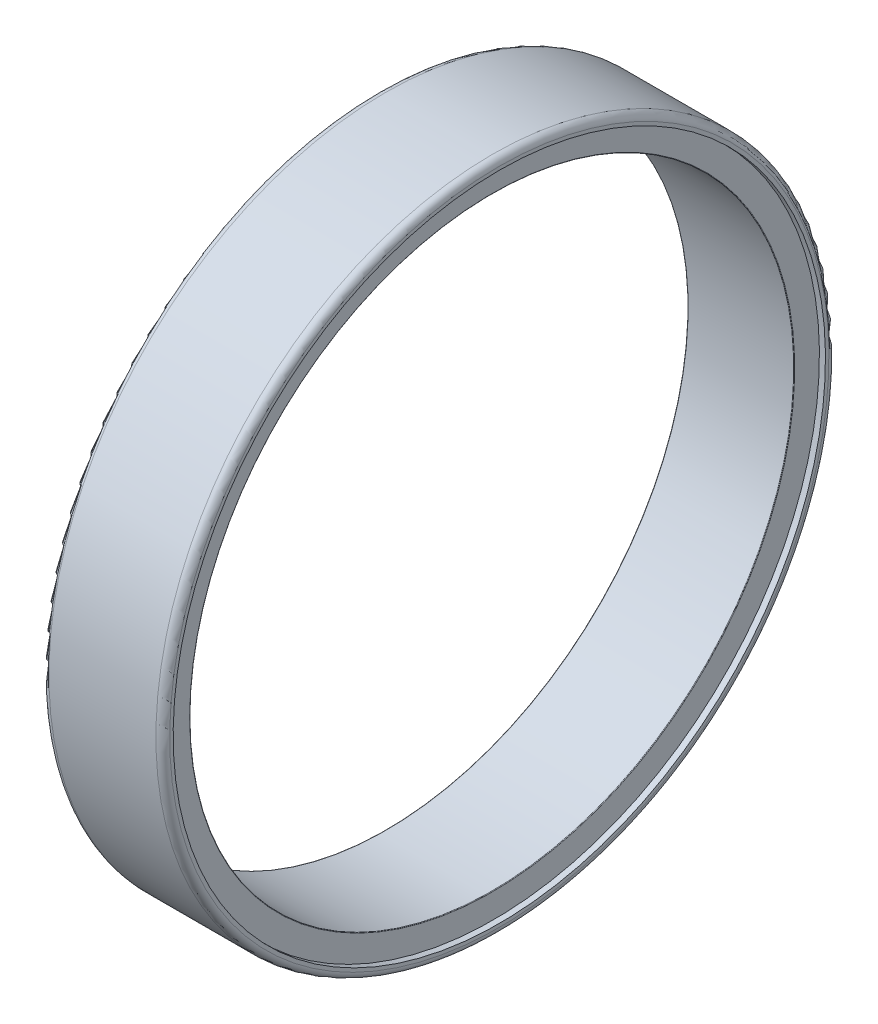
ISO-10303-21;
HEADER;
FILE_DESCRIPTION(('STEP AP214'),'2;1');
FILE_NAME('part.step','',(''),(''),'','','');
FILE_SCHEMA(('AUTOMOTIVE_DESIGN { 1 0 10303 214 1 1 1 1 }'));
ENDSEC;
DATA;
#1=APPLICATION_CONTEXT('core data for automotive mechanical design processes');
#2=APPLICATION_PROTOCOL_DEFINITION('international standard','automotive_design',2000,#1);
#3=PRODUCT_CONTEXT('',#1,'mechanical');
#4=PRODUCT('Part','Part','',(#3));
#5=PRODUCT_RELATED_PRODUCT_CATEGORY('part','',(#4));
#6=PRODUCT_DEFINITION_FORMATION('','',#4);
#7=PRODUCT_DEFINITION_CONTEXT('part definition',#1,'design');
#8=PRODUCT_DEFINITION('design','',#6,#7);
#9=PRODUCT_DEFINITION_SHAPE('','',#8);
#10=(LENGTH_UNIT() NAMED_UNIT(*) SI_UNIT(.MILLI.,.METRE.));
#11=(NAMED_UNIT(*) PLANE_ANGLE_UNIT() SI_UNIT($,.RADIAN.));
#12=(NAMED_UNIT(*) SI_UNIT($,.STERADIAN.) SOLID_ANGLE_UNIT());
#13=UNCERTAINTY_MEASURE_WITH_UNIT(LENGTH_MEASURE(1.E-05),#10,'distance_accuracy_value','');
#14=(GEOMETRIC_REPRESENTATION_CONTEXT(3) GLOBAL_UNCERTAINTY_ASSIGNED_CONTEXT((#13)) GLOBAL_UNIT_ASSIGNED_CONTEXT((#10,
#11,#12)) REPRESENTATION_CONTEXT('',''));
#15=CARTESIAN_POINT('',(0.,0.,0.));
#16=DIRECTION('',(0.,0.,1.));
#17=DIRECTION('',(1.,0.,0.));
#18=AXIS2_PLACEMENT_3D('',#15,#16,#17);
#19=CARTESIAN_POINT('',(-31.75,-1.35165943746456E-13,0.));
#20=DIRECTION('',(1.,0.,0.));
#21=DIRECTION('',(0.,1.,0.));
#22=AXIS2_PLACEMENT_3D('',#19,#20,#21);
#23=CYLINDRICAL_SURFACE('',#22,38.1999999999999);
#24=CARTESIAN_POINT('',(6.30000000000008,0.,0.));
#25=DIRECTION('',(1.,0.,0.));
#26=DIRECTION('',(0.,1.,0.));
#27=AXIS2_PLACEMENT_3D('',#24,#25,#26);
#28=CIRCLE('',#27,38.1999999999999);
#29=CARTESIAN_POINT('',(6.29999999999999,38.1999999999999,0.));
#30=VERTEX_POINT('',#29);
#31=EDGE_CURVE('E70',#30,#30,#28,.T.);
#32=ORIENTED_EDGE('',*,*,#31,.T.);
#33=EDGE_LOOP('',(#32));
#34=FACE_BOUND('',#33,.T.);
#35=CARTESIAN_POINT('',(6.12125120224324,0.,0.));
#36=DIRECTION('',(-1.,0.,0.));
#37=DIRECTION('',(0.,0.,1.));
#38=AXIS2_PLACEMENT_3D('',#35,#36,#37);
#39=CIRCLE('',#38,38.1999999999999);
#40=CARTESIAN_POINT('',(6.12125120224324,0.,38.1999999999999));
#41=VERTEX_POINT('',#40);
#42=EDGE_CURVE('E39',#41,#41,#39,.T.);
#43=ORIENTED_EDGE('',*,*,#42,.T.);
#44=EDGE_LOOP('',(#43));
#45=FACE_BOUND('',#44,.T.);
#46=ADVANCED_FACE('F35',(#34,#45),#23,.F.);
#47=CARTESIAN_POINT('',(-6.29999999999992,0.,0.));
#48=DIRECTION('',(1.,0.,0.));
#49=DIRECTION('',(0.,1.,0.));
#50=AXIS2_PLACEMENT_3D('',#47,#48,#49);
#51=CIRCLE('',#50,38.1999999999999);
#52=CARTESIAN_POINT('',(-6.30000000000001,38.1999999999999,0.));
#53=VERTEX_POINT('',#52);
#54=EDGE_CURVE('E57',#53,#53,#51,.T.);
#55=ORIENTED_EDGE('',*,*,#54,.F.);
#56=EDGE_LOOP('',(#55));
#57=FACE_BOUND('',#56,.T.);
#58=CARTESIAN_POINT('',(-6.12125120224324,0.,0.));
#59=DIRECTION('',(1.,0.,0.));
#60=DIRECTION('',(0.,0.,-1.));
#61=AXIS2_PLACEMENT_3D('',#58,#59,#60);
#62=CIRCLE('',#61,38.1999999999999);
#63=CARTESIAN_POINT('',(-6.12125120224324,0.,-38.1999999999999));
#64=VERTEX_POINT('',#63);
#65=EDGE_CURVE('E51',#64,#64,#62,.T.);
#66=ORIENTED_EDGE('',*,*,#65,.T.);
#67=EDGE_LOOP('',(#66));
#68=FACE_BOUND('',#67,.T.);
#69=ADVANCED_FACE('F105',(#57,#68),#23,.F.);
#70=CARTESIAN_POINT('',(-6.30000000000001,38.1999999999999,0.));
#71=DIRECTION('',(1.,0.,0.));
#72=DIRECTION('',(0.,1.,0.));
#73=AXIS2_PLACEMENT_3D('',#70,#71,#72);
#74=PLANE('',#73);
#75=ORIENTED_EDGE('',*,*,#54,.T.);
#76=EDGE_LOOP('',(#75));
#77=FACE_BOUND('',#76,.T.);
#78=CARTESIAN_POINT('',(-6.29999999999992,0.,0.));
#79=DIRECTION('',(1.,0.,0.));
#80=DIRECTION('',(0.,1.,0.));
#81=AXIS2_PLACEMENT_3D('',#78,#79,#80);
#82=CIRCLE('',#81,37.8);
#83=CARTESIAN_POINT('',(-6.30000000000001,37.7999999999999,0.));
#84=VERTEX_POINT('',#83);
#85=EDGE_CURVE('E10',#84,#84,#82,.T.);
#86=ORIENTED_EDGE('',*,*,#85,.F.);
#87=EDGE_LOOP('',(#86));
#88=FACE_BOUND('',#87,.T.);
#89=ADVANCED_FACE('F37',(#77,#88),#74,.T.);
#90=CARTESIAN_POINT('',(-31.75,-1.35165943746456E-13,0.));
#91=DIRECTION('',(1.,0.,0.));
#92=DIRECTION('',(0.,1.,0.));
#93=AXIS2_PLACEMENT_3D('',#90,#91,#92);
#94=CYLINDRICAL_SURFACE('',#93,37.8);
#95=ORIENTED_EDGE('',*,*,#85,.T.);
#96=EDGE_LOOP('',(#95));
#97=FACE_BOUND('',#96,.T.);
#98=CARTESIAN_POINT('',(-6.99999999999992,0.,0.));
#99=DIRECTION('',(1.,0.,0.));
#100=DIRECTION('',(0.,1.,0.));
#101=AXIS2_PLACEMENT_3D('',#98,#99,#100);
#102=CIRCLE('',#101,37.8);
#103=CARTESIAN_POINT('',(-7.00000000000001,37.7999999999999,0.));
#104=VERTEX_POINT('',#103);
#105=EDGE_CURVE('E43',#104,#104,#102,.T.);
#106=ORIENTED_EDGE('',*,*,#105,.F.);
#107=EDGE_LOOP('',(#106));
#108=FACE_BOUND('',#107,.T.);
#109=ADVANCED_FACE('F95',(#97,#108),#94,.F.);
#110=CARTESIAN_POINT('',(-7.00000000000001,37.7999999999999,0.));
#111=DIRECTION('',(-1.,0.,0.));
#112=DIRECTION('',(0.,-1.,0.));
#113=AXIS2_PLACEMENT_3D('',#110,#111,#112);
#114=PLANE('',#113);
#115=ORIENTED_EDGE('',*,*,#105,.T.);
#116=EDGE_LOOP('',(#115));
#117=FACE_BOUND('',#116,.T.);
#118=CARTESIAN_POINT('',(-6.99999999999992,0.,0.));
#119=DIRECTION('',(1.,0.,0.));
#120=DIRECTION('',(0.,1.,0.));
#121=AXIS2_PLACEMENT_3D('',#118,#119,#120);
#122=CIRCLE('',#121,38.1999999999999);
#123=CARTESIAN_POINT('',(-7.00000000000001,38.1999999999999,0.));
#124=VERTEX_POINT('',#123);
#125=EDGE_CURVE('E48',#124,#124,#122,.T.);
#126=ORIENTED_EDGE('',*,*,#125,.F.);
#127=EDGE_LOOP('',(#126));
#128=FACE_BOUND('',#127,.T.);
#129=ADVANCED_FACE('F93',(#117,#128),#114,.T.);
#130=CARTESIAN_POINT('',(-6.19999999999992,0.,0.));
#131=DIRECTION('',(1.,0.,0.));
#132=DIRECTION('',(0.,1.,0.));
#133=AXIS2_PLACEMENT_3D('',#130,#131,#132);
#134=TOROIDAL_SURFACE('',#133,38.1999999999999,0.800000000000001);
#135=ORIENTED_EDGE('',*,*,#125,.T.);
#136=EDGE_LOOP('',(#135));
#137=FACE_BOUND('',#136,.T.);
#138=CARTESIAN_POINT('',(-6.19999999999991,0.,0.));
#139=DIRECTION('',(1.,0.,0.));
#140=DIRECTION('',(0.,1.,0.));
#141=AXIS2_PLACEMENT_3D('',#138,#139,#140);
#142=CIRCLE('',#141,38.9999999999999);
#143=CARTESIAN_POINT('',(-6.2,38.9999999999999,0.));
#144=VERTEX_POINT('',#143);
#145=EDGE_CURVE('E85',#144,#144,#142,.T.);
#146=ORIENTED_EDGE('',*,*,#145,.F.);
#147=EDGE_LOOP('',(#146));
#148=FACE_BOUND('',#147,.T.);
#149=ADVANCED_FACE('F90',(#137,#148),#134,.T.);
#150=CARTESIAN_POINT('',(-31.75,-1.35165943746456E-13,0.));
#151=DIRECTION('',(1.,0.,0.));
#152=DIRECTION('',(0.,1.,0.));
#153=AXIS2_PLACEMENT_3D('',#150,#151,#152);
#154=CYLINDRICAL_SURFACE('',#153,38.9999999999999);
#155=ORIENTED_EDGE('',*,*,#145,.T.);
#156=EDGE_LOOP('',(#155));
#157=FACE_BOUND('',#156,.T.);
#158=CARTESIAN_POINT('',(6.20000000000009,0.,0.));
#159=DIRECTION('',(1.,0.,0.));
#160=DIRECTION('',(0.,1.,0.));
#161=AXIS2_PLACEMENT_3D('',#158,#159,#160);
#162=CIRCLE('',#161,38.9999999999999);
#163=CARTESIAN_POINT('',(6.2,38.9999999999999,0.));
#164=VERTEX_POINT('',#163);
#165=EDGE_CURVE('E82',#164,#164,#162,.T.);
#166=ORIENTED_EDGE('',*,*,#165,.F.);
#167=EDGE_LOOP('',(#166));
#168=FACE_BOUND('',#167,.T.);
#169=ADVANCED_FACE('F102',(#157,#168),#154,.T.);
#170=CARTESIAN_POINT('',(6.20000000000008,0.,0.));
#171=DIRECTION('',(1.,0.,0.));
#172=DIRECTION('',(0.,1.,0.));
#173=AXIS2_PLACEMENT_3D('',#170,#171,#172);
#174=TOROIDAL_SURFACE('',#173,38.1999999999999,0.799999999999998);
#175=ORIENTED_EDGE('',*,*,#165,.T.);
#176=EDGE_LOOP('',(#175));
#177=FACE_BOUND('',#176,.T.);
#178=CARTESIAN_POINT('',(7.00000000000008,0.,0.));
#179=DIRECTION('',(1.,0.,0.));
#180=DIRECTION('',(0.,1.,0.));
#181=AXIS2_PLACEMENT_3D('',#178,#179,#180);
#182=CIRCLE('',#181,38.1999999999999);
#183=CARTESIAN_POINT('',(6.99999999999999,38.1999999999999,0.));
#184=VERTEX_POINT('',#183);
#185=EDGE_CURVE('E79',#184,#184,#182,.T.);
#186=ORIENTED_EDGE('',*,*,#185,.F.);
#187=EDGE_LOOP('',(#186));
#188=FACE_BOUND('',#187,.T.);
#189=ADVANCED_FACE('F128',(#177,#188),#174,.T.);
#190=CARTESIAN_POINT('',(6.99999999999999,38.1999999999999,0.));
#191=DIRECTION('',(1.,0.,0.));
#192=DIRECTION('',(0.,1.,0.));
#193=AXIS2_PLACEMENT_3D('',#190,#191,#192);
#194=PLANE('',#193);
#195=ORIENTED_EDGE('',*,*,#185,.T.);
#196=EDGE_LOOP('',(#195));
#197=FACE_BOUND('',#196,.T.);
#198=CARTESIAN_POINT('',(7.00000000000008,0.,0.));
#199=DIRECTION('',(1.,0.,0.));
#200=DIRECTION('',(0.,1.,0.));
#201=AXIS2_PLACEMENT_3D('',#198,#199,#200);
#202=CIRCLE('',#201,37.7999999999999);
#203=CARTESIAN_POINT('',(6.99999999999999,37.7999999999999,0.));
#204=VERTEX_POINT('',#203);
#205=EDGE_CURVE('E76',#204,#204,#202,.T.);
#206=ORIENTED_EDGE('',*,*,#205,.F.);
#207=EDGE_LOOP('',(#206));
#208=FACE_BOUND('',#207,.T.);
#209=ADVANCED_FACE('F124',(#197,#208),#194,.T.);
#210=CARTESIAN_POINT('',(-31.75,-1.35165943746456E-13,0.));
#211=DIRECTION('',(1.,0.,0.));
#212=DIRECTION('',(0.,1.,0.));
#213=AXIS2_PLACEMENT_3D('',#210,#211,#212);
#214=CYLINDRICAL_SURFACE('',#213,37.7999999999999);
#215=ORIENTED_EDGE('',*,*,#205,.T.);
#216=EDGE_LOOP('',(#215));
#217=FACE_BOUND('',#216,.T.);
#218=CARTESIAN_POINT('',(6.30000000000008,0.,0.));
#219=DIRECTION('',(1.,0.,0.));
#220=DIRECTION('',(0.,1.,0.));
#221=AXIS2_PLACEMENT_3D('',#218,#219,#220);
#222=CIRCLE('',#221,37.7999999999999);
#223=CARTESIAN_POINT('',(6.3,37.7999999999999,0.));
#224=VERTEX_POINT('',#223);
#225=EDGE_CURVE('E73',#224,#224,#222,.T.);
#226=ORIENTED_EDGE('',*,*,#225,.F.);
#227=EDGE_LOOP('',(#226));
#228=FACE_BOUND('',#227,.T.);
#229=ADVANCED_FACE('F120',(#217,#228),#214,.F.);
#230=CARTESIAN_POINT('',(6.29999999999999,37.7999999999999,0.));
#231=DIRECTION('',(-1.,0.,0.));
#232=DIRECTION('',(0.,-1.,0.));
#233=AXIS2_PLACEMENT_3D('',#230,#231,#232);
#234=PLANE('',#233);
#235=ORIENTED_EDGE('',*,*,#225,.T.);
#236=EDGE_LOOP('',(#235));
#237=FACE_BOUND('',#236,.T.);
#238=ORIENTED_EDGE('',*,*,#31,.F.);
#239=EDGE_LOOP('',(#238));
#240=FACE_BOUND('',#239,.T.);
#241=ADVANCED_FACE('F117',(#237,#240),#234,.T.);
#242=CARTESIAN_POINT('',(-6.10998,0.,0.));
#243=DIRECTION('',(-1.,0.,0.));
#244=DIRECTION('',(0.,0.,1.));
#245=AXIS2_PLACEMENT_3D('',#242,#243,#244);
#246=TOROIDAL_SURFACE('',#245,35.06402,0.0640199999999988);
#247=CARTESIAN_POINT('',(-6.10998,0.,0.));
#248=DIRECTION('',(-1.,0.,0.));
#249=DIRECTION('',(0.,0.,1.));
#250=AXIS2_PLACEMENT_3D('',#247,#248,#249);
#251=CIRCLE('',#250,35.);
#252=CARTESIAN_POINT('',(-6.10998,0.,35.));
#253=VERTEX_POINT('',#252);
#254=EDGE_CURVE('E53',#253,#253,#251,.T.);
#255=ORIENTED_EDGE('',*,*,#254,.F.);
#256=EDGE_LOOP('',(#255));
#257=FACE_BOUND('',#256,.T.);
#258=CARTESIAN_POINT('',(-6.174,0.,0.));
#259=DIRECTION('',(-1.,0.,0.));
#260=DIRECTION('',(0.,0.,1.));
#261=AXIS2_PLACEMENT_3D('',#258,#259,#260);
#262=CIRCLE('',#261,35.06402);
#263=CARTESIAN_POINT('',(-6.174,0.,35.06402));
#264=VERTEX_POINT('',#263);
#265=EDGE_CURVE('E318',#264,#264,#262,.T.);
#266=ORIENTED_EDGE('',*,*,#265,.T.);
#267=EDGE_LOOP('',(#266));
#268=FACE_BOUND('',#267,.T.);
#269=ADVANCED_FACE('F115',(#257,#268),#246,.T.);
#270=CARTESIAN_POINT('',(-25.4,0.,0.));
#271=DIRECTION('',(-1.,0.,0.));
#272=DIRECTION('',(0.,0.,1.));
#273=AXIS2_PLACEMENT_3D('',#270,#271,#272);
#274=CYLINDRICAL_SURFACE('',#273,35.);
#275=CARTESIAN_POINT('',(6.10997999999999,0.,0.));
#276=DIRECTION('',(-1.,0.,0.));
#277=DIRECTION('',(0.,0.,1.));
#278=AXIS2_PLACEMENT_3D('',#275,#276,#277);
#279=CIRCLE('',#278,35.);
#280=CARTESIAN_POINT('',(6.10997999999999,0.,35.));
#281=VERTEX_POINT('',#280);
#282=EDGE_CURVE('E59',#281,#281,#279,.T.);
#283=ORIENTED_EDGE('',*,*,#282,.F.);
#284=EDGE_LOOP('',(#283));
#285=FACE_BOUND('',#284,.T.);
#286=ORIENTED_EDGE('',*,*,#254,.T.);
#287=EDGE_LOOP('',(#286));
#288=FACE_BOUND('',#287,.T.);
#289=ADVANCED_FACE('F172',(#285,#288),#274,.F.);
#290=CARTESIAN_POINT('',(6.10998,0.,0.));
#291=DIRECTION('',(-1.,0.,0.));
#292=DIRECTION('',(0.,0.,1.));
#293=AXIS2_PLACEMENT_3D('',#290,#291,#292);
#294=TOROIDAL_SURFACE('',#293,35.06402,0.0640199999999997);
#295=CARTESIAN_POINT('',(6.174,0.,0.));
#296=DIRECTION('',(-1.,0.,0.));
#297=DIRECTION('',(0.,0.,1.));
#298=AXIS2_PLACEMENT_3D('',#295,#296,#297);
#299=CIRCLE('',#298,35.06402);
#300=CARTESIAN_POINT('',(6.174,0.,35.06402));
#301=VERTEX_POINT('',#300);
#302=EDGE_CURVE('E64',#301,#301,#299,.T.);
#303=ORIENTED_EDGE('',*,*,#302,.F.);
#304=EDGE_LOOP('',(#303));
#305=FACE_BOUND('',#304,.T.);
#306=ORIENTED_EDGE('',*,*,#282,.T.);
#307=EDGE_LOOP('',(#306));
#308=FACE_BOUND('',#307,.T.);
#309=ADVANCED_FACE('F180',(#305,#308),#294,.T.);
#310=CARTESIAN_POINT('',(6.174,38.13698,0.));
#311=DIRECTION('',(-1.,0.,0.));
#312=DIRECTION('',(0.,0.,1.));
#313=AXIS2_PLACEMENT_3D('',#310,#311,#312);
#314=PLANE('',#313);
#315=CARTESIAN_POINT('',(6.17399999999999,0.,0.));
#316=DIRECTION('',(-1.,0.,0.));
#317=DIRECTION('',(0.,0.,1.));
#318=AXIS2_PLACEMENT_3D('',#315,#316,#317);
#319=CIRCLE('',#318,38.13698);
#320=CARTESIAN_POINT('',(6.17399999999999,0.,38.13698));
#321=VERTEX_POINT('',#320);
#322=EDGE_CURVE('E323',#321,#321,#319,.T.);
#323=ORIENTED_EDGE('',*,*,#322,.F.);
#324=EDGE_LOOP('',(#323));
#325=FACE_BOUND('',#324,.T.);
#326=ORIENTED_EDGE('',*,*,#302,.T.);
#327=EDGE_LOOP('',(#326));
#328=FACE_BOUND('',#327,.T.);
#329=ADVANCED_FACE('F187',(#325,#328),#314,.F.);
#330=CARTESIAN_POINT('',(6.10998,0.,0.));
#331=DIRECTION('',(-1.,0.,0.));
#332=DIRECTION('',(0.,0.,1.));
#333=AXIS2_PLACEMENT_3D('',#330,#331,#332);
#334=TOROIDAL_SURFACE('',#333,38.13698,0.064019999999998);
#335=ORIENTED_EDGE('',*,*,#42,.F.);
#336=EDGE_LOOP('',(#335));
#337=FACE_BOUND('',#336,.T.);
#338=ORIENTED_EDGE('',*,*,#322,.T.);
#339=EDGE_LOOP('',(#338));
#340=FACE_BOUND('',#339,.T.);
#341=ADVANCED_FACE('F195',(#337,#340),#334,.T.);
#342=CARTESIAN_POINT('',(-6.10998,0.,0.));
#343=DIRECTION('',(-1.,0.,0.));
#344=DIRECTION('',(0.,0.,1.));
#345=AXIS2_PLACEMENT_3D('',#342,#343,#344);
#346=TOROIDAL_SURFACE('',#345,38.13698,0.0640199999999984);
#347=ORIENTED_EDGE('',*,*,#65,.F.);
#348=EDGE_LOOP('',(#347));
#349=FACE_BOUND('',#348,.T.);
#350=CARTESIAN_POINT('',(-6.174,0.,0.));
#351=DIRECTION('',(-1.,0.,0.));
#352=DIRECTION('',(0.,0.,1.));
#353=AXIS2_PLACEMENT_3D('',#350,#351,#352);
#354=CIRCLE('',#353,38.13698);
#355=CARTESIAN_POINT('',(-6.174,0.,38.13698));
#356=VERTEX_POINT('',#355);
#357=EDGE_CURVE('E321',#356,#356,#354,.T.);
#358=ORIENTED_EDGE('',*,*,#357,.F.);
#359=EDGE_LOOP('',(#358));
#360=FACE_BOUND('',#359,.T.);
#361=ADVANCED_FACE('F203',(#349,#360),#346,.T.);
#362=CARTESIAN_POINT('',(-6.174,38.13698,0.));
#363=DIRECTION('',(1.,0.,0.));
#364=DIRECTION('',(0.,0.,-1.));
#365=AXIS2_PLACEMENT_3D('',#362,#363,#364);
#366=PLANE('',#365);
#367=ORIENTED_EDGE('',*,*,#265,.F.);
#368=EDGE_LOOP('',(#367));
#369=FACE_BOUND('',#368,.T.);
#370=ORIENTED_EDGE('',*,*,#357,.T.);
#371=EDGE_LOOP('',(#370));
#372=FACE_BOUND('',#371,.T.);
#373=ADVANCED_FACE('F211',(#369,#372),#366,.F.);
#374=CLOSED_SHELL('',(#46,#69,#89,#109,#129,#149,#169,#189,#209,#229,#241,#269,#289,#309,#329,
#341,#361,#373));
#375=MANIFOLD_SOLID_BREP('B2',#374);
#376=ADVANCED_BREP_SHAPE_REPRESENTATION('',(#18,#375),#14);
#377=SHAPE_DEFINITION_REPRESENTATION(#9,#376);
ENDSEC;
END-ISO-10303-21;
